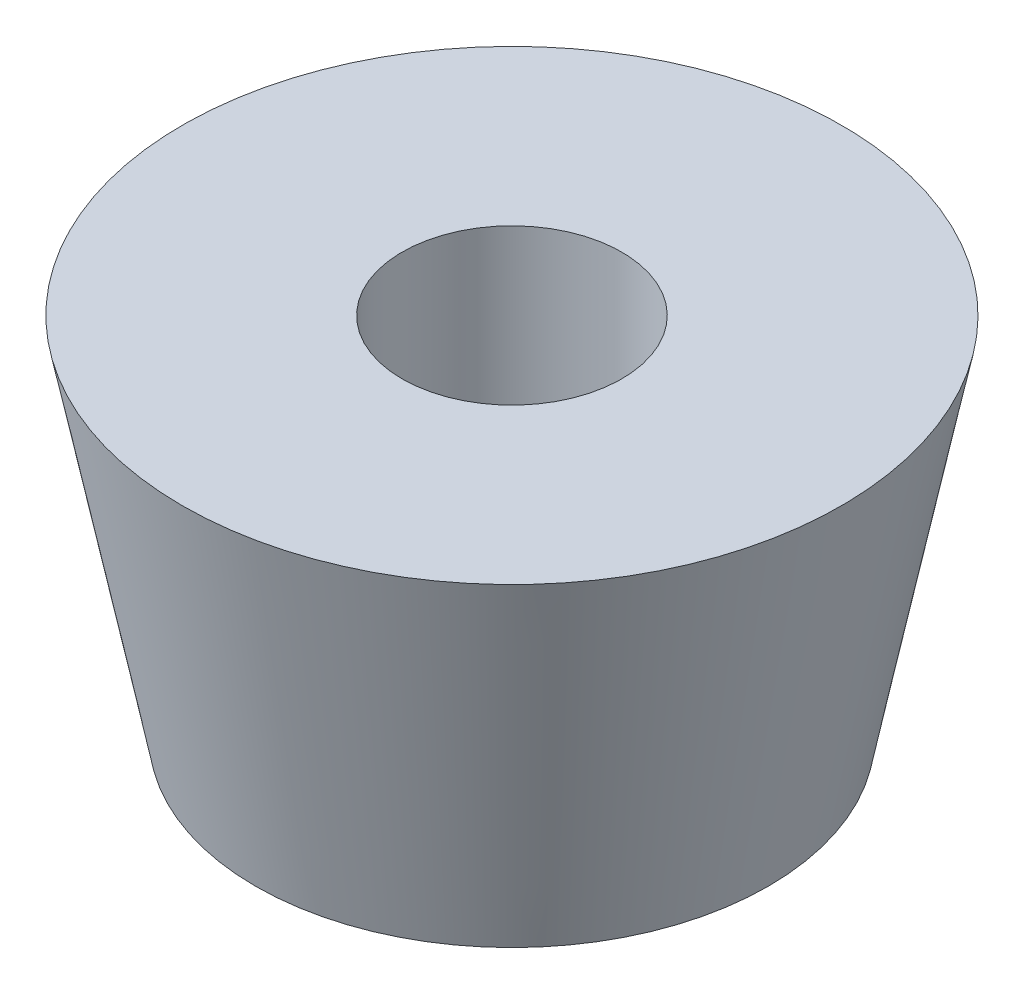
ISO-10303-21;
HEADER;
FILE_DESCRIPTION(('STEP AP214'),'2;1');
FILE_NAME('part.step','',(''),(''),'','','');
FILE_SCHEMA(('AUTOMOTIVE_DESIGN { 1 0 10303 214 1 1 1 1 }'));
ENDSEC;
DATA;
#1=APPLICATION_CONTEXT('core data for automotive mechanical design processes');
#2=APPLICATION_PROTOCOL_DEFINITION('international standard','automotive_design',2000,#1);
#3=PRODUCT_CONTEXT('',#1,'mechanical');
#4=PRODUCT('Part','Part','',(#3));
#5=PRODUCT_RELATED_PRODUCT_CATEGORY('part','',(#4));
#6=PRODUCT_DEFINITION_FORMATION('','',#4);
#7=PRODUCT_DEFINITION_CONTEXT('part definition',#1,'design');
#8=PRODUCT_DEFINITION('design','',#6,#7);
#9=PRODUCT_DEFINITION_SHAPE('','',#8);
#10=(LENGTH_UNIT() NAMED_UNIT(*) SI_UNIT(.MILLI.,.METRE.));
#11=(NAMED_UNIT(*) PLANE_ANGLE_UNIT() SI_UNIT($,.RADIAN.));
#12=(NAMED_UNIT(*) SI_UNIT($,.STERADIAN.) SOLID_ANGLE_UNIT());
#13=UNCERTAINTY_MEASURE_WITH_UNIT(LENGTH_MEASURE(1.E-05),#10,'distance_accuracy_value','');
#14=(GEOMETRIC_REPRESENTATION_CONTEXT(3) GLOBAL_UNCERTAINTY_ASSIGNED_CONTEXT((#13)) GLOBAL_UNIT_ASSIGNED_CONTEXT((#10,
#11,#12)) REPRESENTATION_CONTEXT('',''));
#15=CARTESIAN_POINT('',(0.,0.,0.));
#16=DIRECTION('',(0.,0.,1.));
#17=DIRECTION('',(1.,0.,0.));
#18=AXIS2_PLACEMENT_3D('',#15,#16,#17);
#19=CARTESIAN_POINT('',(0.,0.,-4.5));
#20=DIRECTION('',(0.,-1.,0.));
#21=DIRECTION('',(0.,0.,-1.));
#22=AXIS2_PLACEMENT_3D('',#19,#20,#21);
#23=PLANE('',#22);
#24=CARTESIAN_POINT('',(0.,0.,0.));
#25=DIRECTION('',(0.,1.,0.));
#26=DIRECTION('',(0.,0.,1.));
#27=AXIS2_PLACEMENT_3D('',#24,#25,#26);
#28=CIRCLE('',#27,1.5);
#29=CARTESIAN_POINT('',(0.,0.,1.5));
#30=VERTEX_POINT('',#29);
#31=EDGE_CURVE('E10',#30,#30,#28,.T.);
#32=ORIENTED_EDGE('',*,*,#31,.F.);
#33=EDGE_LOOP('',(#32));
#34=FACE_BOUND('',#33,.T.);
#35=CARTESIAN_POINT('',(0.,0.,0.));
#36=DIRECTION('',(0.,1.,0.));
#37=DIRECTION('',(0.,0.,1.));
#38=AXIS2_PLACEMENT_3D('',#35,#36,#37);
#39=CIRCLE('',#38,4.5);
#40=CARTESIAN_POINT('',(0.,0.,4.5));
#41=VERTEX_POINT('',#40);
#42=EDGE_CURVE('E61',#41,#41,#39,.T.);
#43=ORIENTED_EDGE('',*,*,#42,.T.);
#44=EDGE_LOOP('',(#43));
#45=FACE_BOUND('',#44,.T.);
#46=ADVANCED_FACE('F40',(#34,#45),#23,.F.);
#47=CARTESIAN_POINT('',(0.,0.,0.));
#48=DIRECTION('',(0.,1.,0.));
#49=DIRECTION('',(0.,0.,1.));
#50=AXIS2_PLACEMENT_3D('',#47,#48,#49);
#51=CYLINDRICAL_SURFACE('',#50,1.5);
#52=CARTESIAN_POINT('',(0.,-5.,0.));
#53=DIRECTION('',(0.,1.,0.));
#54=DIRECTION('',(0.,0.,1.));
#55=AXIS2_PLACEMENT_3D('',#52,#53,#54);
#56=CIRCLE('',#55,1.5);
#57=CARTESIAN_POINT('',(0.,-5.,1.5));
#58=VERTEX_POINT('',#57);
#59=EDGE_CURVE('E47',#58,#58,#56,.T.);
#60=ORIENTED_EDGE('',*,*,#59,.F.);
#61=EDGE_LOOP('',(#60));
#62=FACE_BOUND('',#61,.T.);
#63=ORIENTED_EDGE('',*,*,#31,.T.);
#64=EDGE_LOOP('',(#63));
#65=FACE_BOUND('',#64,.T.);
#66=ADVANCED_FACE('F79',(#62,#65),#51,.F.);
#67=CARTESIAN_POINT('',(0.,-5.,-1.5));
#68=DIRECTION('',(0.,1.,0.));
#69=DIRECTION('',(0.,0.,1.));
#70=AXIS2_PLACEMENT_3D('',#67,#68,#69);
#71=PLANE('',#70);
#72=CARTESIAN_POINT('',(0.,-5.,0.));
#73=DIRECTION('',(0.,1.,0.));
#74=DIRECTION('',(0.,0.,1.));
#75=AXIS2_PLACEMENT_3D('',#72,#73,#74);
#76=CIRCLE('',#75,3.5);
#77=CARTESIAN_POINT('',(0.,-5.,3.5));
#78=VERTEX_POINT('',#77);
#79=EDGE_CURVE('E54',#78,#78,#76,.T.);
#80=ORIENTED_EDGE('',*,*,#79,.F.);
#81=EDGE_LOOP('',(#80));
#82=FACE_BOUND('',#81,.T.);
#83=ORIENTED_EDGE('',*,*,#59,.T.);
#84=EDGE_LOOP('',(#83));
#85=FACE_BOUND('',#84,.T.);
#86=ADVANCED_FACE('F74',(#82,#85),#71,.F.);
#87=CARTESIAN_POINT('',(0.,-5.,0.));
#88=DIRECTION('',(0.,1.,0.));
#89=DIRECTION('',(0.,0.,1.));
#90=AXIS2_PLACEMENT_3D('',#87,#88,#89);
#91=CONICAL_SURFACE('',#90,3.5,0.197395559849881);
#92=ORIENTED_EDGE('',*,*,#42,.F.);
#93=EDGE_LOOP('',(#92));
#94=FACE_BOUND('',#93,.T.);
#95=ORIENTED_EDGE('',*,*,#79,.T.);
#96=EDGE_LOOP('',(#95));
#97=FACE_BOUND('',#96,.T.);
#98=ADVANCED_FACE('F71',(#94,#97),#91,.T.);
#99=CLOSED_SHELL('',(#46,#66,#86,#98));
#100=MANIFOLD_SOLID_BREP('B2',#99);
#101=ADVANCED_BREP_SHAPE_REPRESENTATION('',(#18,#100),#14);
#102=SHAPE_DEFINITION_REPRESENTATION(#9,#101);
ENDSEC;
END-ISO-10303-21;
